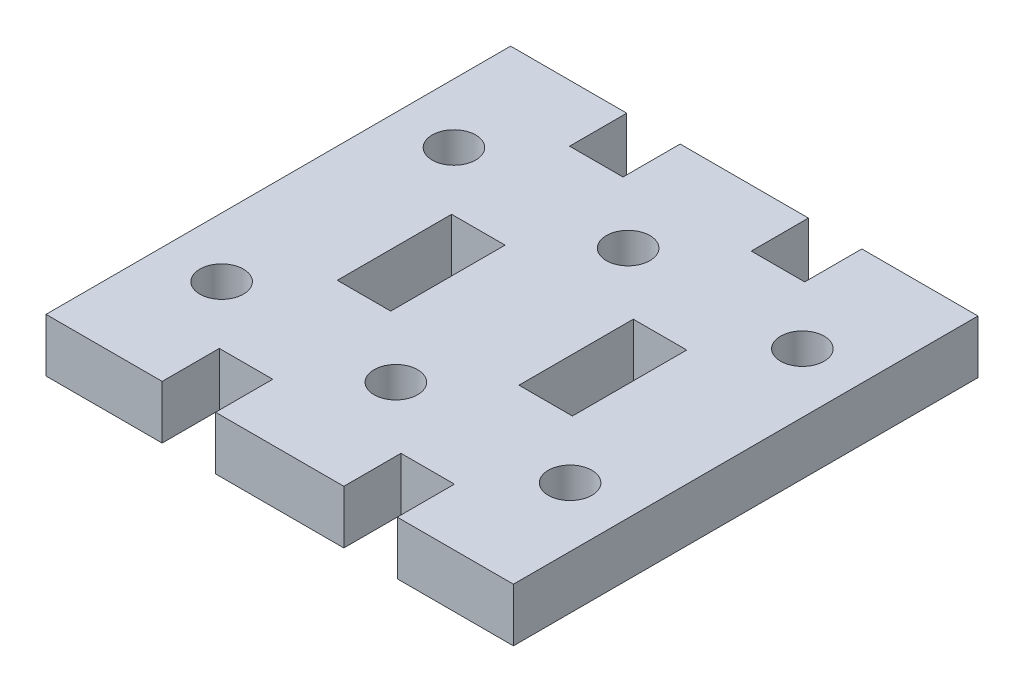
ISO-10303-21;
HEADER;
FILE_DESCRIPTION(('STEP AP214'),'2;1');
FILE_NAME('part.step','',(''),(''),'','','');
FILE_SCHEMA(('AUTOMOTIVE_DESIGN { 1 0 10303 214 1 1 1 1 }'));
ENDSEC;
DATA;
#1=APPLICATION_CONTEXT('core data for automotive mechanical design processes');
#2=APPLICATION_PROTOCOL_DEFINITION('international standard','automotive_design',2000,#1);
#3=PRODUCT_CONTEXT('',#1,'mechanical');
#4=PRODUCT('Part','Part','',(#3));
#5=PRODUCT_RELATED_PRODUCT_CATEGORY('part','',(#4));
#6=PRODUCT_DEFINITION_FORMATION('','',#4);
#7=PRODUCT_DEFINITION_CONTEXT('part definition',#1,'design');
#8=PRODUCT_DEFINITION('design','',#6,#7);
#9=PRODUCT_DEFINITION_SHAPE('','',#8);
#10=(LENGTH_UNIT() NAMED_UNIT(*) SI_UNIT(.MILLI.,.METRE.));
#11=(NAMED_UNIT(*) PLANE_ANGLE_UNIT() SI_UNIT($,.RADIAN.));
#12=(NAMED_UNIT(*) SI_UNIT($,.STERADIAN.) SOLID_ANGLE_UNIT());
#13=UNCERTAINTY_MEASURE_WITH_UNIT(LENGTH_MEASURE(1.E-05),#10,'distance_accuracy_value','');
#14=(GEOMETRIC_REPRESENTATION_CONTEXT(3) GLOBAL_UNCERTAINTY_ASSIGNED_CONTEXT((#13)) GLOBAL_UNIT_ASSIGNED_CONTEXT((#10,
#11,#12)) REPRESENTATION_CONTEXT('',''));
#15=CARTESIAN_POINT('',(0.,0.,0.));
#16=DIRECTION('',(0.,0.,1.));
#17=DIRECTION('',(1.,0.,0.));
#18=AXIS2_PLACEMENT_3D('',#15,#16,#17);
#19=CARTESIAN_POINT('',(0.,5.842,0.));
#20=DIRECTION('',(0.,1.,0.));
#21=DIRECTION('',(0.,0.,1.));
#22=AXIS2_PLACEMENT_3D('',#19,#20,#21);
#23=PLANE('',#22);
#24=CARTESIAN_POINT('',(-19.05,5.842,12.7));
#25=DIRECTION('',(0.,1.,0.));
#26=DIRECTION('',(0.,0.,1.));
#27=AXIS2_PLACEMENT_3D('',#24,#25,#26);
#28=CIRCLE('',#27,2.38125);
#29=CARTESIAN_POINT('',(-19.05,5.842,15.08125));
#30=VERTEX_POINT('',#29);
#31=EDGE_CURVE('E848',#30,#30,#28,.T.);
#32=ORIENTED_EDGE('',*,*,#31,.F.);
#33=EDGE_LOOP('',(#32));
#34=FACE_BOUND('',#33,.T.);
#35=CARTESIAN_POINT('',(-19.05,5.842,-12.7));
#36=DIRECTION('',(0.,1.,0.));
#37=DIRECTION('',(0.,0.,-1.));
#38=AXIS2_PLACEMENT_3D('',#35,#36,#37);
#39=CIRCLE('',#38,2.38125);
#40=CARTESIAN_POINT('',(-19.05,5.842,-15.08125));
#41=VERTEX_POINT('',#40);
#42=EDGE_CURVE('E850',#41,#41,#39,.T.);
#43=ORIENTED_EDGE('',*,*,#42,.F.);
#44=EDGE_LOOP('',(#43));
#45=FACE_BOUND('',#44,.T.);
#46=CARTESIAN_POINT('',(19.05,5.842,12.7));
#47=DIRECTION('',(0.,1.,0.));
#48=DIRECTION('',(0.,0.,-1.));
#49=AXIS2_PLACEMENT_3D('',#46,#47,#48);
#50=CIRCLE('',#49,2.38125);
#51=CARTESIAN_POINT('',(19.05,5.842,10.31875));
#52=VERTEX_POINT('',#51);
#53=EDGE_CURVE('E856',#52,#52,#50,.T.);
#54=ORIENTED_EDGE('',*,*,#53,.F.);
#55=EDGE_LOOP('',(#54));
#56=FACE_BOUND('',#55,.T.);
#57=CARTESIAN_POINT('',(19.05,5.842,-12.7));
#58=DIRECTION('',(0.,1.,0.));
#59=DIRECTION('',(0.,0.,1.));
#60=AXIS2_PLACEMENT_3D('',#57,#58,#59);
#61=CIRCLE('',#60,2.38125);
#62=CARTESIAN_POINT('',(19.05,5.842,-10.31875));
#63=VERTEX_POINT('',#62);
#64=EDGE_CURVE('E862',#63,#63,#61,.T.);
#65=ORIENTED_EDGE('',*,*,#64,.F.);
#66=EDGE_LOOP('',(#65));
#67=FACE_BOUND('',#66,.T.);
#68=CARTESIAN_POINT('',(0.,5.842,-12.7));
#69=DIRECTION('',(0.,1.,0.));
#70=DIRECTION('',(0.,0.,-1.));
#71=AXIS2_PLACEMENT_3D('',#68,#69,#70);
#72=CIRCLE('',#71,2.38125);
#73=CARTESIAN_POINT('',(0.,5.842,-15.08125));
#74=VERTEX_POINT('',#73);
#75=EDGE_CURVE('E868',#74,#74,#72,.T.);
#76=ORIENTED_EDGE('',*,*,#75,.F.);
#77=EDGE_LOOP('',(#76));
#78=FACE_BOUND('',#77,.T.);
#79=CARTESIAN_POINT('',(0.,5.842,12.7));
#80=DIRECTION('',(0.,1.,0.));
#81=DIRECTION('',(0.,0.,1.));
#82=AXIS2_PLACEMENT_3D('',#79,#80,#81);
#83=CIRCLE('',#82,2.38125);
#84=CARTESIAN_POINT('',(0.,5.842,15.08125));
#85=VERTEX_POINT('',#84);
#86=EDGE_CURVE('E874',#85,#85,#83,.T.);
#87=ORIENTED_EDGE('',*,*,#86,.F.);
#88=EDGE_LOOP('',(#87));
#89=FACE_BOUND('',#88,.T.);
#90=DIRECTION('',(0.,0.,1.));
#91=VECTOR('',#90,1.);
#92=CARTESIAN_POINT('',(-7.012,5.842,-19.15));
#93=LINE('',#92,#91);
#94=CARTESIAN_POINT('',(-7.012,5.842,-25.4));
#95=VERTEX_POINT('',#94);
#96=CARTESIAN_POINT('',(-7.012,5.842,-19.15));
#97=VERTEX_POINT('',#96);
#98=EDGE_CURVE('E289',#95,#97,#93,.T.);
#99=ORIENTED_EDGE('',*,*,#98,.T.);
#100=DIRECTION('',(-1.,0.,0.));
#101=VECTOR('',#100,1.);
#102=CARTESIAN_POINT('',(-12.854,5.842,-19.15));
#103=LINE('',#102,#101);
#104=CARTESIAN_POINT('',(-12.854,5.842,-19.15));
#105=VERTEX_POINT('',#104);
#106=EDGE_CURVE('E292',#97,#105,#103,.T.);
#107=ORIENTED_EDGE('',*,*,#106,.T.);
#108=DIRECTION('',(0.,0.,-1.));
#109=VECTOR('',#108,1.);
#110=CARTESIAN_POINT('',(-12.854,5.842,-19.15));
#111=LINE('',#110,#109);
#112=CARTESIAN_POINT('',(-12.854,5.842,-25.4));
#113=VERTEX_POINT('',#112);
#114=EDGE_CURVE('E295',#105,#113,#111,.T.);
#115=ORIENTED_EDGE('',*,*,#114,.T.);
#116=DIRECTION('',(-1.,0.,0.));
#117=VECTOR('',#116,1.);
#118=CARTESIAN_POINT('',(-25.554,5.842,-25.4));
#119=LINE('',#118,#117);
#120=CARTESIAN_POINT('',(-25.554,5.842,-25.4));
#121=VERTEX_POINT('',#120);
#122=EDGE_CURVE('E297',#113,#121,#119,.T.);
#123=ORIENTED_EDGE('',*,*,#122,.T.);
#124=DIRECTION('',(0.,0.,1.));
#125=VECTOR('',#124,1.);
#126=CARTESIAN_POINT('',(-25.554,5.842,25.4));
#127=LINE('',#126,#125);
#128=CARTESIAN_POINT('',(-25.554,5.842,25.4));
#129=VERTEX_POINT('',#128);
#130=EDGE_CURVE('E299',#121,#129,#127,.T.);
#131=ORIENTED_EDGE('',*,*,#130,.T.);
#132=DIRECTION('',(1.,0.,0.));
#133=VECTOR('',#132,1.);
#134=CARTESIAN_POINT('',(-25.554,5.842,25.4));
#135=LINE('',#134,#133);
#136=CARTESIAN_POINT('',(-12.854,5.842,25.4));
#137=VERTEX_POINT('',#136);
#138=EDGE_CURVE('E301',#129,#137,#135,.T.);
#139=ORIENTED_EDGE('',*,*,#138,.T.);
#140=DIRECTION('',(0.,0.,-1.));
#141=VECTOR('',#140,1.);
#142=CARTESIAN_POINT('',(-12.854,5.842,25.4));
#143=LINE('',#142,#141);
#144=CARTESIAN_POINT('',(-12.854,5.842,19.15));
#145=VERTEX_POINT('',#144);
#146=EDGE_CURVE('E303',#137,#145,#143,.T.);
#147=ORIENTED_EDGE('',*,*,#146,.T.);
#148=DIRECTION('',(1.,0.,0.));
#149=VECTOR('',#148,1.);
#150=CARTESIAN_POINT('',(-12.854,5.842,19.15));
#151=LINE('',#150,#149);
#152=CARTESIAN_POINT('',(-7.012,5.842,19.15));
#153=VERTEX_POINT('',#152);
#154=EDGE_CURVE('E305',#145,#153,#151,.T.);
#155=ORIENTED_EDGE('',*,*,#154,.T.);
#156=DIRECTION('',(0.,0.,1.));
#157=VECTOR('',#156,1.);
#158=CARTESIAN_POINT('',(-7.012,5.842,25.4));
#159=LINE('',#158,#157);
#160=CARTESIAN_POINT('',(-7.012,5.842,25.4));
#161=VERTEX_POINT('',#160);
#162=EDGE_CURVE('E307',#153,#161,#159,.T.);
#163=ORIENTED_EDGE('',*,*,#162,.T.);
#164=DIRECTION('',(1.,0.,0.));
#165=VECTOR('',#164,1.);
#166=CARTESIAN_POINT('',(7.012,5.842,25.4));
#167=LINE('',#166,#165);
#168=CARTESIAN_POINT('',(7.012,5.842,25.4));
#169=VERTEX_POINT('',#168);
#170=EDGE_CURVE('E309',#161,#169,#167,.T.);
#171=ORIENTED_EDGE('',*,*,#170,.T.);
#172=DIRECTION('',(0.,0.,-1.));
#173=VECTOR('',#172,1.);
#174=CARTESIAN_POINT('',(7.012,5.842,25.4));
#175=LINE('',#174,#173);
#176=CARTESIAN_POINT('',(7.012,5.842,19.15));
#177=VERTEX_POINT('',#176);
#178=EDGE_CURVE('E311',#169,#177,#175,.T.);
#179=ORIENTED_EDGE('',*,*,#178,.T.);
#180=DIRECTION('',(1.,0.,0.));
#181=VECTOR('',#180,1.);
#182=CARTESIAN_POINT('',(12.854,5.842,19.15));
#183=LINE('',#182,#181);
#184=CARTESIAN_POINT('',(12.854,5.842,19.15));
#185=VERTEX_POINT('',#184);
#186=EDGE_CURVE('E313',#177,#185,#183,.T.);
#187=ORIENTED_EDGE('',*,*,#186,.T.);
#188=DIRECTION('',(0.,0.,1.));
#189=VECTOR('',#188,1.);
#190=CARTESIAN_POINT('',(12.854,5.842,25.4));
#191=LINE('',#190,#189);
#192=CARTESIAN_POINT('',(12.854,5.842,25.4));
#193=VERTEX_POINT('',#192);
#194=EDGE_CURVE('E315',#185,#193,#191,.T.);
#195=ORIENTED_EDGE('',*,*,#194,.T.);
#196=DIRECTION('',(1.,0.,0.));
#197=VECTOR('',#196,1.);
#198=CARTESIAN_POINT('',(25.554,5.842,25.4));
#199=LINE('',#198,#197);
#200=CARTESIAN_POINT('',(25.554,5.842,25.4));
#201=VERTEX_POINT('',#200);
#202=EDGE_CURVE('E317',#193,#201,#199,.T.);
#203=ORIENTED_EDGE('',*,*,#202,.T.);
#204=DIRECTION('',(0.,0.,-1.));
#205=VECTOR('',#204,1.);
#206=CARTESIAN_POINT('',(25.554,5.842,25.4));
#207=LINE('',#206,#205);
#208=CARTESIAN_POINT('',(25.554,5.842,-25.4));
#209=VERTEX_POINT('',#208);
#210=EDGE_CURVE('E319',#201,#209,#207,.T.);
#211=ORIENTED_EDGE('',*,*,#210,.T.);
#212=DIRECTION('',(-1.,0.,0.));
#213=VECTOR('',#212,1.);
#214=CARTESIAN_POINT('',(25.554,5.842,-25.4));
#215=LINE('',#214,#213);
#216=CARTESIAN_POINT('',(12.854,5.842,-25.4));
#217=VERTEX_POINT('',#216);
#218=EDGE_CURVE('E321',#209,#217,#215,.T.);
#219=ORIENTED_EDGE('',*,*,#218,.T.);
#220=DIRECTION('',(0.,0.,1.));
#221=VECTOR('',#220,1.);
#222=CARTESIAN_POINT('',(12.854,5.842,-19.15));
#223=LINE('',#222,#221);
#224=CARTESIAN_POINT('',(12.854,5.842,-19.15));
#225=VERTEX_POINT('',#224);
#226=EDGE_CURVE('E323',#217,#225,#223,.T.);
#227=ORIENTED_EDGE('',*,*,#226,.T.);
#228=DIRECTION('',(-1.,0.,0.));
#229=VECTOR('',#228,1.);
#230=CARTESIAN_POINT('',(12.854,5.842,-19.15));
#231=LINE('',#230,#229);
#232=CARTESIAN_POINT('',(7.012,5.842,-19.15));
#233=VERTEX_POINT('',#232);
#234=EDGE_CURVE('E325',#225,#233,#231,.T.);
#235=ORIENTED_EDGE('',*,*,#234,.T.);
#236=DIRECTION('',(0.,0.,-1.));
#237=VECTOR('',#236,1.);
#238=CARTESIAN_POINT('',(7.012,5.842,-19.15));
#239=LINE('',#238,#237);
#240=CARTESIAN_POINT('',(7.012,5.842,-25.4));
#241=VERTEX_POINT('',#240);
#242=EDGE_CURVE('E327',#233,#241,#239,.T.);
#243=ORIENTED_EDGE('',*,*,#242,.T.);
#244=DIRECTION('',(-1.,0.,0.));
#245=VECTOR('',#244,1.);
#246=CARTESIAN_POINT('',(7.012,5.842,-25.4));
#247=LINE('',#246,#245);
#248=EDGE_CURVE('E329',#241,#95,#247,.T.);
#249=ORIENTED_EDGE('',*,*,#248,.T.);
#250=EDGE_LOOP('',(#99,#107,#115,#123,#131,#139,#147,#155,#163,#171,#179,#187,#195,#203,#211,
#219,#227,#235,#243,#249));
#251=FACE_BOUND('',#250,.T.);
#252=DIRECTION('',(1.,0.,0.));
#253=VECTOR('',#252,1.);
#254=CARTESIAN_POINT('',(-12.854,5.842,6.24999999999999));
#255=LINE('',#254,#253);
#256=CARTESIAN_POINT('',(-12.854,5.842,6.24999999999999));
#257=VERTEX_POINT('',#256);
#258=CARTESIAN_POINT('',(-7.012,5.842,6.24999999999999));
#259=VERTEX_POINT('',#258);
#260=EDGE_CURVE('E260',#257,#259,#255,.T.);
#261=ORIENTED_EDGE('',*,*,#260,.F.);
#262=DIRECTION('',(0.,0.,1.));
#263=VECTOR('',#262,1.);
#264=CARTESIAN_POINT('',(-12.854,5.842,6.24999999999999));
#265=LINE('',#264,#263);
#266=CARTESIAN_POINT('',(-12.854,5.842,-6.25));
#267=VERTEX_POINT('',#266);
#268=EDGE_CURVE('E258',#267,#257,#265,.T.);
#269=ORIENTED_EDGE('',*,*,#268,.F.);
#270=DIRECTION('',(-1.,0.,0.));
#271=VECTOR('',#270,1.);
#272=CARTESIAN_POINT('',(-12.854,5.842,-6.25));
#273=LINE('',#272,#271);
#274=CARTESIAN_POINT('',(-7.012,5.842,-6.25));
#275=VERTEX_POINT('',#274);
#276=EDGE_CURVE('E266',#275,#267,#273,.T.);
#277=ORIENTED_EDGE('',*,*,#276,.F.);
#278=DIRECTION('',(0.,0.,-1.));
#279=VECTOR('',#278,1.);
#280=CARTESIAN_POINT('',(-7.012,5.842,6.24999999999999));
#281=LINE('',#280,#279);
#282=EDGE_CURVE('E263',#259,#275,#281,.T.);
#283=ORIENTED_EDGE('',*,*,#282,.F.);
#284=EDGE_LOOP('',(#261,#269,#277,#283));
#285=FACE_BOUND('',#284,.T.);
#286=DIRECTION('',(0.,0.,-1.));
#287=VECTOR('',#286,1.);
#288=CARTESIAN_POINT('',(12.854,5.842,6.24999999999999));
#289=LINE('',#288,#287);
#290=CARTESIAN_POINT('',(12.854,5.842,6.24999999999999));
#291=VERTEX_POINT('',#290);
#292=CARTESIAN_POINT('',(12.854,5.842,-6.25));
#293=VERTEX_POINT('',#292);
#294=EDGE_CURVE('E228',#291,#293,#289,.T.);
#295=ORIENTED_EDGE('',*,*,#294,.F.);
#296=DIRECTION('',(1.,0.,0.));
#297=VECTOR('',#296,1.);
#298=CARTESIAN_POINT('',(12.854,5.842,6.24999999999999));
#299=LINE('',#298,#297);
#300=CARTESIAN_POINT('',(7.012,5.842,6.24999999999999));
#301=VERTEX_POINT('',#300);
#302=EDGE_CURVE('E220',#301,#291,#299,.T.);
#303=ORIENTED_EDGE('',*,*,#302,.F.);
#304=DIRECTION('',(0.,0.,1.));
#305=VECTOR('',#304,1.);
#306=CARTESIAN_POINT('',(7.012,5.842,6.24999999999999));
#307=LINE('',#306,#305);
#308=CARTESIAN_POINT('',(7.012,5.842,-6.25));
#309=VERTEX_POINT('',#308);
#310=EDGE_CURVE('E242',#309,#301,#307,.T.);
#311=ORIENTED_EDGE('',*,*,#310,.F.);
#312=DIRECTION('',(-1.,0.,0.));
#313=VECTOR('',#312,1.);
#314=CARTESIAN_POINT('',(12.854,5.842,-6.25));
#315=LINE('',#314,#313);
#316=EDGE_CURVE('E240',#293,#309,#315,.T.);
#317=ORIENTED_EDGE('',*,*,#316,.F.);
#318=EDGE_LOOP('',(#295,#303,#311,#317));
#319=FACE_BOUND('',#318,.T.);
#320=ADVANCED_FACE('F35',(#34,#45,#56,#67,#78,#89,#251,#285,#319),#23,.T.);
#321=CARTESIAN_POINT('',(0.,0.,0.));
#322=DIRECTION('',(0.,1.,0.));
#323=DIRECTION('',(0.,0.,1.));
#324=AXIS2_PLACEMENT_3D('',#321,#322,#323);
#325=PLANE('',#324);
#326=CARTESIAN_POINT('',(-19.05,0.,12.7));
#327=DIRECTION('',(0.,1.,0.));
#328=DIRECTION('',(0.,0.,1.));
#329=AXIS2_PLACEMENT_3D('',#326,#327,#328);
#330=CIRCLE('',#329,2.38125);
#331=CARTESIAN_POINT('',(-19.05,0.,15.08125));
#332=VERTEX_POINT('',#331);
#333=EDGE_CURVE('E846',#332,#332,#330,.T.);
#334=ORIENTED_EDGE('',*,*,#333,.T.);
#335=EDGE_LOOP('',(#334));
#336=FACE_BOUND('',#335,.T.);
#337=CARTESIAN_POINT('',(-19.05,0.,-12.7));
#338=DIRECTION('',(0.,1.,0.));
#339=DIRECTION('',(0.,0.,-1.));
#340=AXIS2_PLACEMENT_3D('',#337,#338,#339);
#341=CIRCLE('',#340,2.38125);
#342=CARTESIAN_POINT('',(-19.05,0.,-15.08125));
#343=VERTEX_POINT('',#342);
#344=EDGE_CURVE('E853',#343,#343,#341,.T.);
#345=ORIENTED_EDGE('',*,*,#344,.T.);
#346=EDGE_LOOP('',(#345));
#347=FACE_BOUND('',#346,.T.);
#348=CARTESIAN_POINT('',(19.05,0.,12.7));
#349=DIRECTION('',(0.,1.,0.));
#350=DIRECTION('',(0.,0.,-1.));
#351=AXIS2_PLACEMENT_3D('',#348,#349,#350);
#352=CIRCLE('',#351,2.38125);
#353=CARTESIAN_POINT('',(19.05,0.,10.31875));
#354=VERTEX_POINT('',#353);
#355=EDGE_CURVE('E859',#354,#354,#352,.T.);
#356=ORIENTED_EDGE('',*,*,#355,.T.);
#357=EDGE_LOOP('',(#356));
#358=FACE_BOUND('',#357,.T.);
#359=CARTESIAN_POINT('',(19.05,0.,-12.7));
#360=DIRECTION('',(0.,1.,0.));
#361=DIRECTION('',(0.,0.,1.));
#362=AXIS2_PLACEMENT_3D('',#359,#360,#361);
#363=CIRCLE('',#362,2.38125);
#364=CARTESIAN_POINT('',(19.05,0.,-10.31875));
#365=VERTEX_POINT('',#364);
#366=EDGE_CURVE('E865',#365,#365,#363,.T.);
#367=ORIENTED_EDGE('',*,*,#366,.T.);
#368=EDGE_LOOP('',(#367));
#369=FACE_BOUND('',#368,.T.);
#370=CARTESIAN_POINT('',(0.,0.,-12.7));
#371=DIRECTION('',(0.,1.,0.));
#372=DIRECTION('',(0.,0.,-1.));
#373=AXIS2_PLACEMENT_3D('',#370,#371,#372);
#374=CIRCLE('',#373,2.38125);
#375=CARTESIAN_POINT('',(0.,0.,-15.08125));
#376=VERTEX_POINT('',#375);
#377=EDGE_CURVE('E871',#376,#376,#374,.T.);
#378=ORIENTED_EDGE('',*,*,#377,.T.);
#379=EDGE_LOOP('',(#378));
#380=FACE_BOUND('',#379,.T.);
#381=CARTESIAN_POINT('',(0.,0.,12.7));
#382=DIRECTION('',(0.,1.,0.));
#383=DIRECTION('',(0.,0.,1.));
#384=AXIS2_PLACEMENT_3D('',#381,#382,#383);
#385=CIRCLE('',#384,2.38125);
#386=CARTESIAN_POINT('',(0.,0.,15.08125));
#387=VERTEX_POINT('',#386);
#388=EDGE_CURVE('E248',#387,#387,#385,.T.);
#389=ORIENTED_EDGE('',*,*,#388,.T.);
#390=EDGE_LOOP('',(#389));
#391=FACE_BOUND('',#390,.T.);
#392=DIRECTION('',(0.,0.,1.));
#393=VECTOR('',#392,1.);
#394=CARTESIAN_POINT('',(-12.854,0.,6.24999999999999));
#395=LINE('',#394,#393);
#396=CARTESIAN_POINT('',(-12.854,0.,-6.25));
#397=VERTEX_POINT('',#396);
#398=CARTESIAN_POINT('',(-12.854,0.,6.24999999999999));
#399=VERTEX_POINT('',#398);
#400=EDGE_CURVE('E236',#397,#399,#395,.T.);
#401=ORIENTED_EDGE('',*,*,#400,.T.);
#402=DIRECTION('',(1.,0.,0.));
#403=VECTOR('',#402,1.);
#404=CARTESIAN_POINT('',(-12.854,0.,6.24999999999999));
#405=LINE('',#404,#403);
#406=CARTESIAN_POINT('',(-7.012,0.,6.24999999999999));
#407=VERTEX_POINT('',#406);
#408=EDGE_CURVE('E271',#399,#407,#405,.T.);
#409=ORIENTED_EDGE('',*,*,#408,.T.);
#410=DIRECTION('',(0.,0.,-1.));
#411=VECTOR('',#410,1.);
#412=CARTESIAN_POINT('',(-7.012,0.,6.24999999999999));
#413=LINE('',#412,#411);
#414=CARTESIAN_POINT('',(-7.012,0.,-6.25));
#415=VERTEX_POINT('',#414);
#416=EDGE_CURVE('E274',#407,#415,#413,.T.);
#417=ORIENTED_EDGE('',*,*,#416,.T.);
#418=DIRECTION('',(-1.,0.,0.));
#419=VECTOR('',#418,1.);
#420=CARTESIAN_POINT('',(-12.854,0.,-6.25));
#421=LINE('',#420,#419);
#422=EDGE_CURVE('E261',#415,#397,#421,.T.);
#423=ORIENTED_EDGE('',*,*,#422,.T.);
#424=EDGE_LOOP('',(#401,#409,#417,#423));
#425=FACE_BOUND('',#424,.T.);
#426=DIRECTION('',(0.,0.,1.));
#427=VECTOR('',#426,1.);
#428=CARTESIAN_POINT('',(-7.012,0.,-19.15));
#429=LINE('',#428,#427);
#430=CARTESIAN_POINT('',(-7.012,0.,-25.4));
#431=VERTEX_POINT('',#430);
#432=CARTESIAN_POINT('',(-7.012,0.,-19.15));
#433=VERTEX_POINT('',#432);
#434=EDGE_CURVE('E288',#431,#433,#429,.T.);
#435=ORIENTED_EDGE('',*,*,#434,.F.);
#436=DIRECTION('',(-1.,0.,0.));
#437=VECTOR('',#436,1.);
#438=CARTESIAN_POINT('',(7.012,0.,-25.4));
#439=LINE('',#438,#437);
#440=CARTESIAN_POINT('',(7.012,0.,-25.4));
#441=VERTEX_POINT('',#440);
#442=EDGE_CURVE('E293',#441,#431,#439,.T.);
#443=ORIENTED_EDGE('',*,*,#442,.F.);
#444=DIRECTION('',(0.,0.,-1.));
#445=VECTOR('',#444,1.);
#446=CARTESIAN_POINT('',(7.012,0.,-19.15));
#447=LINE('',#446,#445);
#448=CARTESIAN_POINT('',(7.012,0.,-19.15));
#449=VERTEX_POINT('',#448);
#450=EDGE_CURVE('E368',#449,#441,#447,.T.);
#451=ORIENTED_EDGE('',*,*,#450,.F.);
#452=DIRECTION('',(-1.,0.,0.));
#453=VECTOR('',#452,1.);
#454=CARTESIAN_POINT('',(12.854,0.,-19.15));
#455=LINE('',#454,#453);
#456=CARTESIAN_POINT('',(12.854,0.,-19.15));
#457=VERTEX_POINT('',#456);
#458=EDGE_CURVE('E366',#457,#449,#455,.T.);
#459=ORIENTED_EDGE('',*,*,#458,.F.);
#460=DIRECTION('',(0.,0.,1.));
#461=VECTOR('',#460,1.);
#462=CARTESIAN_POINT('',(12.854,0.,-19.15));
#463=LINE('',#462,#461);
#464=CARTESIAN_POINT('',(12.854,0.,-25.4));
#465=VERTEX_POINT('',#464);
#466=EDGE_CURVE('E364',#465,#457,#463,.T.);
#467=ORIENTED_EDGE('',*,*,#466,.F.);
#468=DIRECTION('',(-1.,0.,0.));
#469=VECTOR('',#468,1.);
#470=CARTESIAN_POINT('',(25.554,0.,-25.4));
#471=LINE('',#470,#469);
#472=CARTESIAN_POINT('',(25.554,0.,-25.4));
#473=VERTEX_POINT('',#472);
#474=EDGE_CURVE('E362',#473,#465,#471,.T.);
#475=ORIENTED_EDGE('',*,*,#474,.F.);
#476=DIRECTION('',(0.,0.,-1.));
#477=VECTOR('',#476,1.);
#478=CARTESIAN_POINT('',(25.554,0.,25.4));
#479=LINE('',#478,#477);
#480=CARTESIAN_POINT('',(25.554,0.,25.4));
#481=VERTEX_POINT('',#480);
#482=EDGE_CURVE('E360',#481,#473,#479,.T.);
#483=ORIENTED_EDGE('',*,*,#482,.F.);
#484=DIRECTION('',(1.,0.,0.));
#485=VECTOR('',#484,1.);
#486=CARTESIAN_POINT('',(25.554,0.,25.4));
#487=LINE('',#486,#485);
#488=CARTESIAN_POINT('',(12.854,0.,25.4));
#489=VERTEX_POINT('',#488);
#490=EDGE_CURVE('E358',#489,#481,#487,.T.);
#491=ORIENTED_EDGE('',*,*,#490,.F.);
#492=DIRECTION('',(0.,0.,1.));
#493=VECTOR('',#492,1.);
#494=CARTESIAN_POINT('',(12.854,0.,25.4));
#495=LINE('',#494,#493);
#496=CARTESIAN_POINT('',(12.854,0.,19.15));
#497=VERTEX_POINT('',#496);
#498=EDGE_CURVE('E356',#497,#489,#495,.T.);
#499=ORIENTED_EDGE('',*,*,#498,.F.);
#500=DIRECTION('',(1.,0.,0.));
#501=VECTOR('',#500,1.);
#502=CARTESIAN_POINT('',(12.854,0.,19.15));
#503=LINE('',#502,#501);
#504=CARTESIAN_POINT('',(7.012,0.,19.15));
#505=VERTEX_POINT('',#504);
#506=EDGE_CURVE('E354',#505,#497,#503,.T.);
#507=ORIENTED_EDGE('',*,*,#506,.F.);
#508=DIRECTION('',(0.,0.,-1.));
#509=VECTOR('',#508,1.);
#510=CARTESIAN_POINT('',(7.012,0.,25.4));
#511=LINE('',#510,#509);
#512=CARTESIAN_POINT('',(7.012,0.,25.4));
#513=VERTEX_POINT('',#512);
#514=EDGE_CURVE('E352',#513,#505,#511,.T.);
#515=ORIENTED_EDGE('',*,*,#514,.F.);
#516=DIRECTION('',(1.,0.,0.));
#517=VECTOR('',#516,1.);
#518=CARTESIAN_POINT('',(7.012,0.,25.4));
#519=LINE('',#518,#517);
#520=CARTESIAN_POINT('',(-7.012,0.,25.4));
#521=VERTEX_POINT('',#520);
#522=EDGE_CURVE('E350',#521,#513,#519,.T.);
#523=ORIENTED_EDGE('',*,*,#522,.F.);
#524=DIRECTION('',(0.,0.,1.));
#525=VECTOR('',#524,1.);
#526=CARTESIAN_POINT('',(-7.012,0.,25.4));
#527=LINE('',#526,#525);
#528=CARTESIAN_POINT('',(-7.012,0.,19.15));
#529=VERTEX_POINT('',#528);
#530=EDGE_CURVE('E348',#529,#521,#527,.T.);
#531=ORIENTED_EDGE('',*,*,#530,.F.);
#532=DIRECTION('',(1.,0.,0.));
#533=VECTOR('',#532,1.);
#534=CARTESIAN_POINT('',(-12.854,0.,19.15));
#535=LINE('',#534,#533);
#536=CARTESIAN_POINT('',(-12.854,0.,19.15));
#537=VERTEX_POINT('',#536);
#538=EDGE_CURVE('E346',#537,#529,#535,.T.);
#539=ORIENTED_EDGE('',*,*,#538,.F.);
#540=DIRECTION('',(0.,0.,-1.));
#541=VECTOR('',#540,1.);
#542=CARTESIAN_POINT('',(-12.854,0.,25.4));
#543=LINE('',#542,#541);
#544=CARTESIAN_POINT('',(-12.854,0.,25.4));
#545=VERTEX_POINT('',#544);
#546=EDGE_CURVE('E344',#545,#537,#543,.T.);
#547=ORIENTED_EDGE('',*,*,#546,.F.);
#548=DIRECTION('',(1.,0.,0.));
#549=VECTOR('',#548,1.);
#550=CARTESIAN_POINT('',(-25.554,0.,25.4));
#551=LINE('',#550,#549);
#552=CARTESIAN_POINT('',(-25.554,0.,25.4));
#553=VERTEX_POINT('',#552);
#554=EDGE_CURVE('E342',#553,#545,#551,.T.);
#555=ORIENTED_EDGE('',*,*,#554,.F.);
#556=DIRECTION('',(0.,0.,1.));
#557=VECTOR('',#556,1.);
#558=CARTESIAN_POINT('',(-25.554,0.,25.4));
#559=LINE('',#558,#557);
#560=CARTESIAN_POINT('',(-25.554,0.,-25.4));
#561=VERTEX_POINT('',#560);
#562=EDGE_CURVE('E340',#561,#553,#559,.T.);
#563=ORIENTED_EDGE('',*,*,#562,.F.);
#564=DIRECTION('',(-1.,0.,0.));
#565=VECTOR('',#564,1.);
#566=CARTESIAN_POINT('',(-25.554,0.,-25.4));
#567=LINE('',#566,#565);
#568=CARTESIAN_POINT('',(-12.854,0.,-25.4));
#569=VERTEX_POINT('',#568);
#570=EDGE_CURVE('E338',#569,#561,#567,.T.);
#571=ORIENTED_EDGE('',*,*,#570,.F.);
#572=DIRECTION('',(0.,0.,-1.));
#573=VECTOR('',#572,1.);
#574=CARTESIAN_POINT('',(-12.854,0.,-19.15));
#575=LINE('',#574,#573);
#576=CARTESIAN_POINT('',(-12.854,0.,-19.15));
#577=VERTEX_POINT('',#576);
#578=EDGE_CURVE('E336',#577,#569,#575,.T.);
#579=ORIENTED_EDGE('',*,*,#578,.F.);
#580=DIRECTION('',(-1.,0.,0.));
#581=VECTOR('',#580,1.);
#582=CARTESIAN_POINT('',(-12.854,0.,-19.15));
#583=LINE('',#582,#581);
#584=EDGE_CURVE('E334',#433,#577,#583,.T.);
#585=ORIENTED_EDGE('',*,*,#584,.F.);
#586=EDGE_LOOP('',(#435,#443,#451,#459,#467,#475,#483,#491,#499,#507,#515,#523,#531,#539,#547,
#555,#563,#571,#579,#585));
#587=FACE_BOUND('',#586,.T.);
#588=DIRECTION('',(1.,0.,0.));
#589=VECTOR('',#588,1.);
#590=CARTESIAN_POINT('',(12.854,0.,6.24999999999999));
#591=LINE('',#590,#589);
#592=CARTESIAN_POINT('',(7.012,0.,6.24999999999999));
#593=VERTEX_POINT('',#592);
#594=CARTESIAN_POINT('',(12.854,0.,6.24999999999999));
#595=VERTEX_POINT('',#594);
#596=EDGE_CURVE('E58',#593,#595,#591,.T.);
#597=ORIENTED_EDGE('',*,*,#596,.T.);
#598=DIRECTION('',(0.,0.,-1.));
#599=VECTOR('',#598,1.);
#600=CARTESIAN_POINT('',(12.854,0.,6.24999999999999));
#601=LINE('',#600,#599);
#602=CARTESIAN_POINT('',(12.854,0.,-6.25));
#603=VERTEX_POINT('',#602);
#604=EDGE_CURVE('E235',#595,#603,#601,.T.);
#605=ORIENTED_EDGE('',*,*,#604,.T.);
#606=DIRECTION('',(-1.,0.,0.));
#607=VECTOR('',#606,1.);
#608=CARTESIAN_POINT('',(12.854,0.,-6.25));
#609=LINE('',#608,#607);
#610=CARTESIAN_POINT('',(7.012,0.,-6.25));
#611=VERTEX_POINT('',#610);
#612=EDGE_CURVE('E250',#603,#611,#609,.T.);
#613=ORIENTED_EDGE('',*,*,#612,.T.);
#614=DIRECTION('',(0.,0.,1.));
#615=VECTOR('',#614,1.);
#616=CARTESIAN_POINT('',(7.012,0.,6.24999999999999));
#617=LINE('',#616,#615);
#618=EDGE_CURVE('E229',#611,#593,#617,.T.);
#619=ORIENTED_EDGE('',*,*,#618,.T.);
#620=EDGE_LOOP('',(#597,#605,#613,#619));
#621=FACE_BOUND('',#620,.T.);
#622=ADVANCED_FACE('F434',(#336,#347,#358,#369,#380,#391,#425,#587,#621),#325,.F.);
#623=CARTESIAN_POINT('',(-7.012,5.842,-19.15));
#624=DIRECTION('',(1.,0.,0.));
#625=DIRECTION('',(0.,0.,-1.));
#626=AXIS2_PLACEMENT_3D('',#623,#624,#625);
#627=PLANE('',#626);
#628=ORIENTED_EDGE('',*,*,#434,.T.);
#629=DIRECTION('',(0.,-1.,0.));
#630=VECTOR('',#629,1.);
#631=CARTESIAN_POINT('',(-7.012,5.842,-19.15));
#632=LINE('',#631,#630);
#633=EDGE_CURVE('E11',#97,#433,#632,.T.);
#634=ORIENTED_EDGE('',*,*,#633,.F.);
#635=ORIENTED_EDGE('',*,*,#98,.F.);
#636=DIRECTION('',(0.,-1.,0.));
#637=VECTOR('',#636,1.);
#638=CARTESIAN_POINT('',(-7.012,5.842,-25.4));
#639=LINE('',#638,#637);
#640=EDGE_CURVE('E331',#95,#431,#639,.T.);
#641=ORIENTED_EDGE('',*,*,#640,.T.);
#642=EDGE_LOOP('',(#628,#634,#635,#641));
#643=FACE_BOUND('',#642,.T.);
#644=ADVANCED_FACE('F37',(#643),#627,.F.);
#645=CARTESIAN_POINT('',(-12.854,5.842,-19.15));
#646=DIRECTION('',(0.,0.,1.));
#647=DIRECTION('',(1.,0.,0.));
#648=AXIS2_PLACEMENT_3D('',#645,#646,#647);
#649=PLANE('',#648);
#650=ORIENTED_EDGE('',*,*,#584,.T.);
#651=DIRECTION('',(0.,-1.,0.));
#652=VECTOR('',#651,1.);
#653=CARTESIAN_POINT('',(-12.854,5.842,-19.15));
#654=LINE('',#653,#652);
#655=EDGE_CURVE('E43',#105,#577,#654,.T.);
#656=ORIENTED_EDGE('',*,*,#655,.F.);
#657=ORIENTED_EDGE('',*,*,#106,.F.);
#658=ORIENTED_EDGE('',*,*,#633,.T.);
#659=EDGE_LOOP('',(#650,#656,#657,#658));
#660=FACE_BOUND('',#659,.T.);
#661=ADVANCED_FACE('F452',(#660),#649,.F.);
#662=CARTESIAN_POINT('',(-12.854,5.842,-19.15));
#663=DIRECTION('',(-1.,0.,0.));
#664=DIRECTION('',(0.,0.,1.));
#665=AXIS2_PLACEMENT_3D('',#662,#663,#664);
#666=PLANE('',#665);
#667=ORIENTED_EDGE('',*,*,#578,.T.);
#668=DIRECTION('',(0.,-1.,0.));
#669=VECTOR('',#668,1.);
#670=CARTESIAN_POINT('',(-12.854,5.842,-25.4));
#671=LINE('',#670,#669);
#672=EDGE_CURVE('E421',#113,#569,#671,.T.);
#673=ORIENTED_EDGE('',*,*,#672,.F.);
#674=ORIENTED_EDGE('',*,*,#114,.F.);
#675=ORIENTED_EDGE('',*,*,#655,.T.);
#676=EDGE_LOOP('',(#667,#673,#674,#675));
#677=FACE_BOUND('',#676,.T.);
#678=ADVANCED_FACE('F428',(#677),#666,.F.);
#679=CARTESIAN_POINT('',(-25.554,5.842,-25.4));
#680=DIRECTION('',(0.,0.,1.));
#681=DIRECTION('',(1.,0.,0.));
#682=AXIS2_PLACEMENT_3D('',#679,#680,#681);
#683=PLANE('',#682);
#684=ORIENTED_EDGE('',*,*,#570,.T.);
#685=DIRECTION('',(0.,-1.,0.));
#686=VECTOR('',#685,1.);
#687=CARTESIAN_POINT('',(-25.554,5.842,-25.4));
#688=LINE('',#687,#686);
#689=EDGE_CURVE('E418',#121,#561,#688,.T.);
#690=ORIENTED_EDGE('',*,*,#689,.F.);
#691=ORIENTED_EDGE('',*,*,#122,.F.);
#692=ORIENTED_EDGE('',*,*,#672,.T.);
#693=EDGE_LOOP('',(#684,#690,#691,#692));
#694=FACE_BOUND('',#693,.T.);
#695=ADVANCED_FACE('F440',(#694),#683,.F.);
#696=CARTESIAN_POINT('',(-25.554,5.842,25.4));
#697=DIRECTION('',(1.,0.,0.));
#698=DIRECTION('',(0.,0.,-1.));
#699=AXIS2_PLACEMENT_3D('',#696,#697,#698);
#700=PLANE('',#699);
#701=ORIENTED_EDGE('',*,*,#562,.T.);
#702=DIRECTION('',(0.,-1.,0.));
#703=VECTOR('',#702,1.);
#704=CARTESIAN_POINT('',(-25.554,5.842,25.4));
#705=LINE('',#704,#703);
#706=EDGE_CURVE('E415',#129,#553,#705,.T.);
#707=ORIENTED_EDGE('',*,*,#706,.F.);
#708=ORIENTED_EDGE('',*,*,#130,.F.);
#709=ORIENTED_EDGE('',*,*,#689,.T.);
#710=EDGE_LOOP('',(#701,#707,#708,#709));
#711=FACE_BOUND('',#710,.T.);
#712=ADVANCED_FACE('F444',(#711),#700,.F.);
#713=CARTESIAN_POINT('',(-25.554,5.842,25.4));
#714=DIRECTION('',(0.,0.,-1.));
#715=DIRECTION('',(-1.,0.,0.));
#716=AXIS2_PLACEMENT_3D('',#713,#714,#715);
#717=PLANE('',#716);
#718=ORIENTED_EDGE('',*,*,#554,.T.);
#719=DIRECTION('',(0.,-1.,0.));
#720=VECTOR('',#719,1.);
#721=CARTESIAN_POINT('',(-12.854,5.842,25.4));
#722=LINE('',#721,#720);
#723=EDGE_CURVE('E412',#137,#545,#722,.T.);
#724=ORIENTED_EDGE('',*,*,#723,.F.);
#725=ORIENTED_EDGE('',*,*,#138,.F.);
#726=ORIENTED_EDGE('',*,*,#706,.T.);
#727=EDGE_LOOP('',(#718,#724,#725,#726));
#728=FACE_BOUND('',#727,.T.);
#729=ADVANCED_FACE('F525',(#728),#717,.F.);
#730=CARTESIAN_POINT('',(-12.854,5.842,25.4));
#731=DIRECTION('',(-1.,0.,0.));
#732=DIRECTION('',(0.,0.,1.));
#733=AXIS2_PLACEMENT_3D('',#730,#731,#732);
#734=PLANE('',#733);
#735=ORIENTED_EDGE('',*,*,#546,.T.);
#736=DIRECTION('',(0.,-1.,0.));
#737=VECTOR('',#736,1.);
#738=CARTESIAN_POINT('',(-12.854,5.842,19.15));
#739=LINE('',#738,#737);
#740=EDGE_CURVE('E409',#145,#537,#739,.T.);
#741=ORIENTED_EDGE('',*,*,#740,.F.);
#742=ORIENTED_EDGE('',*,*,#146,.F.);
#743=ORIENTED_EDGE('',*,*,#723,.T.);
#744=EDGE_LOOP('',(#735,#741,#742,#743));
#745=FACE_BOUND('',#744,.T.);
#746=ADVANCED_FACE('F523',(#745),#734,.F.);
#747=CARTESIAN_POINT('',(-12.854,5.842,19.15));
#748=DIRECTION('',(0.,0.,-1.));
#749=DIRECTION('',(-1.,0.,0.));
#750=AXIS2_PLACEMENT_3D('',#747,#748,#749);
#751=PLANE('',#750);
#752=ORIENTED_EDGE('',*,*,#538,.T.);
#753=DIRECTION('',(0.,-1.,0.));
#754=VECTOR('',#753,1.);
#755=CARTESIAN_POINT('',(-7.012,5.842,19.15));
#756=LINE('',#755,#754);
#757=EDGE_CURVE('E406',#153,#529,#756,.T.);
#758=ORIENTED_EDGE('',*,*,#757,.F.);
#759=ORIENTED_EDGE('',*,*,#154,.F.);
#760=ORIENTED_EDGE('',*,*,#740,.T.);
#761=EDGE_LOOP('',(#752,#758,#759,#760));
#762=FACE_BOUND('',#761,.T.);
#763=ADVANCED_FACE('F518',(#762),#751,.F.);
#764=CARTESIAN_POINT('',(-7.012,5.842,25.4));
#765=DIRECTION('',(1.,0.,0.));
#766=DIRECTION('',(0.,0.,-1.));
#767=AXIS2_PLACEMENT_3D('',#764,#765,#766);
#768=PLANE('',#767);
#769=ORIENTED_EDGE('',*,*,#530,.T.);
#770=DIRECTION('',(0.,-1.,0.));
#771=VECTOR('',#770,1.);
#772=CARTESIAN_POINT('',(-7.012,5.842,25.4));
#773=LINE('',#772,#771);
#774=EDGE_CURVE('E403',#161,#521,#773,.T.);
#775=ORIENTED_EDGE('',*,*,#774,.F.);
#776=ORIENTED_EDGE('',*,*,#162,.F.);
#777=ORIENTED_EDGE('',*,*,#757,.T.);
#778=EDGE_LOOP('',(#769,#775,#776,#777));
#779=FACE_BOUND('',#778,.T.);
#780=ADVANCED_FACE('F513',(#779),#768,.F.);
#781=CARTESIAN_POINT('',(7.012,5.842,25.4));
#782=DIRECTION('',(0.,0.,-1.));
#783=DIRECTION('',(-1.,0.,0.));
#784=AXIS2_PLACEMENT_3D('',#781,#782,#783);
#785=PLANE('',#784);
#786=ORIENTED_EDGE('',*,*,#522,.T.);
#787=DIRECTION('',(0.,-1.,0.));
#788=VECTOR('',#787,1.);
#789=CARTESIAN_POINT('',(7.012,5.842,25.4));
#790=LINE('',#789,#788);
#791=EDGE_CURVE('E400',#169,#513,#790,.T.);
#792=ORIENTED_EDGE('',*,*,#791,.F.);
#793=ORIENTED_EDGE('',*,*,#170,.F.);
#794=ORIENTED_EDGE('',*,*,#774,.T.);
#795=EDGE_LOOP('',(#786,#792,#793,#794));
#796=FACE_BOUND('',#795,.T.);
#797=ADVANCED_FACE('F509',(#796),#785,.F.);
#798=CARTESIAN_POINT('',(7.012,5.842,25.4));
#799=DIRECTION('',(-1.,0.,0.));
#800=DIRECTION('',(0.,0.,1.));
#801=AXIS2_PLACEMENT_3D('',#798,#799,#800);
#802=PLANE('',#801);
#803=ORIENTED_EDGE('',*,*,#514,.T.);
#804=DIRECTION('',(0.,-1.,0.));
#805=VECTOR('',#804,1.);
#806=CARTESIAN_POINT('',(7.012,5.842,19.15));
#807=LINE('',#806,#805);
#808=EDGE_CURVE('E397',#177,#505,#807,.T.);
#809=ORIENTED_EDGE('',*,*,#808,.F.);
#810=ORIENTED_EDGE('',*,*,#178,.F.);
#811=ORIENTED_EDGE('',*,*,#791,.T.);
#812=EDGE_LOOP('',(#803,#809,#810,#811));
#813=FACE_BOUND('',#812,.T.);
#814=ADVANCED_FACE('F504',(#813),#802,.F.);
#815=CARTESIAN_POINT('',(12.854,5.842,19.15));
#816=DIRECTION('',(0.,0.,-1.));
#817=DIRECTION('',(-1.,0.,0.));
#818=AXIS2_PLACEMENT_3D('',#815,#816,#817);
#819=PLANE('',#818);
#820=ORIENTED_EDGE('',*,*,#506,.T.);
#821=DIRECTION('',(0.,-1.,0.));
#822=VECTOR('',#821,1.);
#823=CARTESIAN_POINT('',(12.854,5.842,19.15));
#824=LINE('',#823,#822);
#825=EDGE_CURVE('E394',#185,#497,#824,.T.);
#826=ORIENTED_EDGE('',*,*,#825,.F.);
#827=ORIENTED_EDGE('',*,*,#186,.F.);
#828=ORIENTED_EDGE('',*,*,#808,.T.);
#829=EDGE_LOOP('',(#820,#826,#827,#828));
#830=FACE_BOUND('',#829,.T.);
#831=ADVANCED_FACE('F498',(#830),#819,.F.);
#832=CARTESIAN_POINT('',(12.854,5.842,25.4));
#833=DIRECTION('',(1.,0.,0.));
#834=DIRECTION('',(0.,0.,-1.));
#835=AXIS2_PLACEMENT_3D('',#832,#833,#834);
#836=PLANE('',#835);
#837=ORIENTED_EDGE('',*,*,#498,.T.);
#838=DIRECTION('',(0.,-1.,0.));
#839=VECTOR('',#838,1.);
#840=CARTESIAN_POINT('',(12.854,5.842,25.4));
#841=LINE('',#840,#839);
#842=EDGE_CURVE('E391',#193,#489,#841,.T.);
#843=ORIENTED_EDGE('',*,*,#842,.F.);
#844=ORIENTED_EDGE('',*,*,#194,.F.);
#845=ORIENTED_EDGE('',*,*,#825,.T.);
#846=EDGE_LOOP('',(#837,#843,#844,#845));
#847=FACE_BOUND('',#846,.T.);
#848=ADVANCED_FACE('F494',(#847),#836,.F.);
#849=CARTESIAN_POINT('',(25.554,5.842,25.4));
#850=DIRECTION('',(0.,0.,-1.));
#851=DIRECTION('',(-1.,0.,0.));
#852=AXIS2_PLACEMENT_3D('',#849,#850,#851);
#853=PLANE('',#852);
#854=ORIENTED_EDGE('',*,*,#490,.T.);
#855=DIRECTION('',(0.,-1.,0.));
#856=VECTOR('',#855,1.);
#857=CARTESIAN_POINT('',(25.554,5.842,25.4));
#858=LINE('',#857,#856);
#859=EDGE_CURVE('E388',#201,#481,#858,.T.);
#860=ORIENTED_EDGE('',*,*,#859,.F.);
#861=ORIENTED_EDGE('',*,*,#202,.F.);
#862=ORIENTED_EDGE('',*,*,#842,.T.);
#863=EDGE_LOOP('',(#854,#860,#861,#862));
#864=FACE_BOUND('',#863,.T.);
#865=ADVANCED_FACE('F489',(#864),#853,.F.);
#866=CARTESIAN_POINT('',(25.554,5.842,25.4));
#867=DIRECTION('',(-1.,0.,0.));
#868=DIRECTION('',(0.,0.,1.));
#869=AXIS2_PLACEMENT_3D('',#866,#867,#868);
#870=PLANE('',#869);
#871=ORIENTED_EDGE('',*,*,#482,.T.);
#872=DIRECTION('',(0.,-1.,0.));
#873=VECTOR('',#872,1.);
#874=CARTESIAN_POINT('',(25.554,5.842,-25.4));
#875=LINE('',#874,#873);
#876=EDGE_CURVE('E385',#209,#473,#875,.T.);
#877=ORIENTED_EDGE('',*,*,#876,.F.);
#878=ORIENTED_EDGE('',*,*,#210,.F.);
#879=ORIENTED_EDGE('',*,*,#859,.T.);
#880=EDGE_LOOP('',(#871,#877,#878,#879));
#881=FACE_BOUND('',#880,.T.);
#882=ADVANCED_FACE('F483',(#881),#870,.F.);
#883=CARTESIAN_POINT('',(25.554,5.842,-25.4));
#884=DIRECTION('',(0.,0.,1.));
#885=DIRECTION('',(1.,0.,0.));
#886=AXIS2_PLACEMENT_3D('',#883,#884,#885);
#887=PLANE('',#886);
#888=ORIENTED_EDGE('',*,*,#474,.T.);
#889=DIRECTION('',(0.,-1.,0.));
#890=VECTOR('',#889,1.);
#891=CARTESIAN_POINT('',(12.854,5.842,-25.4));
#892=LINE('',#891,#890);
#893=EDGE_CURVE('E382',#217,#465,#892,.T.);
#894=ORIENTED_EDGE('',*,*,#893,.F.);
#895=ORIENTED_EDGE('',*,*,#218,.F.);
#896=ORIENTED_EDGE('',*,*,#876,.T.);
#897=EDGE_LOOP('',(#888,#894,#895,#896));
#898=FACE_BOUND('',#897,.T.);
#899=ADVANCED_FACE('F479',(#898),#887,.F.);
#900=CARTESIAN_POINT('',(12.854,5.842,-19.15));
#901=DIRECTION('',(1.,0.,0.));
#902=DIRECTION('',(0.,0.,-1.));
#903=AXIS2_PLACEMENT_3D('',#900,#901,#902);
#904=PLANE('',#903);
#905=ORIENTED_EDGE('',*,*,#466,.T.);
#906=DIRECTION('',(0.,-1.,0.));
#907=VECTOR('',#906,1.);
#908=CARTESIAN_POINT('',(12.854,5.842,-19.15));
#909=LINE('',#908,#907);
#910=EDGE_CURVE('E379',#225,#457,#909,.T.);
#911=ORIENTED_EDGE('',*,*,#910,.F.);
#912=ORIENTED_EDGE('',*,*,#226,.F.);
#913=ORIENTED_EDGE('',*,*,#893,.T.);
#914=EDGE_LOOP('',(#905,#911,#912,#913));
#915=FACE_BOUND('',#914,.T.);
#916=ADVANCED_FACE('F474',(#915),#904,.F.);
#917=CARTESIAN_POINT('',(12.854,5.842,-19.15));
#918=DIRECTION('',(0.,0.,1.));
#919=DIRECTION('',(1.,0.,0.));
#920=AXIS2_PLACEMENT_3D('',#917,#918,#919);
#921=PLANE('',#920);
#922=ORIENTED_EDGE('',*,*,#458,.T.);
#923=DIRECTION('',(0.,-1.,0.));
#924=VECTOR('',#923,1.);
#925=CARTESIAN_POINT('',(7.012,5.842,-19.15));
#926=LINE('',#925,#924);
#927=EDGE_CURVE('E376',#233,#449,#926,.T.);
#928=ORIENTED_EDGE('',*,*,#927,.F.);
#929=ORIENTED_EDGE('',*,*,#234,.F.);
#930=ORIENTED_EDGE('',*,*,#910,.T.);
#931=EDGE_LOOP('',(#922,#928,#929,#930));
#932=FACE_BOUND('',#931,.T.);
#933=ADVANCED_FACE('F468',(#932),#921,.F.);
#934=CARTESIAN_POINT('',(7.012,5.842,-19.15));
#935=DIRECTION('',(-1.,0.,0.));
#936=DIRECTION('',(0.,0.,1.));
#937=AXIS2_PLACEMENT_3D('',#934,#935,#936);
#938=PLANE('',#937);
#939=ORIENTED_EDGE('',*,*,#450,.T.);
#940=DIRECTION('',(0.,-1.,0.));
#941=VECTOR('',#940,1.);
#942=CARTESIAN_POINT('',(7.012,5.842,-25.4));
#943=LINE('',#942,#941);
#944=EDGE_CURVE('E373',#241,#441,#943,.T.);
#945=ORIENTED_EDGE('',*,*,#944,.F.);
#946=ORIENTED_EDGE('',*,*,#242,.F.);
#947=ORIENTED_EDGE('',*,*,#927,.T.);
#948=EDGE_LOOP('',(#939,#945,#946,#947));
#949=FACE_BOUND('',#948,.T.);
#950=ADVANCED_FACE('F464',(#949),#938,.F.);
#951=CARTESIAN_POINT('',(7.012,5.842,-25.4));
#952=DIRECTION('',(0.,0.,1.));
#953=DIRECTION('',(1.,0.,0.));
#954=AXIS2_PLACEMENT_3D('',#951,#952,#953);
#955=PLANE('',#954);
#956=ORIENTED_EDGE('',*,*,#442,.T.);
#957=ORIENTED_EDGE('',*,*,#640,.F.);
#958=ORIENTED_EDGE('',*,*,#248,.F.);
#959=ORIENTED_EDGE('',*,*,#944,.T.);
#960=EDGE_LOOP('',(#956,#957,#958,#959));
#961=FACE_BOUND('',#960,.T.);
#962=ADVANCED_FACE('F459',(#961),#955,.F.);
#963=CARTESIAN_POINT('',(-12.854,5.842,6.24999999999999));
#964=DIRECTION('',(1.,0.,0.));
#965=DIRECTION('',(0.,0.,-1.));
#966=AXIS2_PLACEMENT_3D('',#963,#964,#965);
#967=PLANE('',#966);
#968=ORIENTED_EDGE('',*,*,#400,.F.);
#969=DIRECTION('',(0.,-1.,0.));
#970=VECTOR('',#969,1.);
#971=CARTESIAN_POINT('',(-12.854,5.842,-6.25));
#972=LINE('',#971,#970);
#973=EDGE_CURVE('E268',#267,#397,#972,.T.);
#974=ORIENTED_EDGE('',*,*,#973,.F.);
#975=ORIENTED_EDGE('',*,*,#268,.T.);
#976=DIRECTION('',(0.,-1.,0.));
#977=VECTOR('',#976,1.);
#978=CARTESIAN_POINT('',(-12.854,5.842,6.24999999999999));
#979=LINE('',#978,#977);
#980=EDGE_CURVE('E285',#257,#399,#979,.T.);
#981=ORIENTED_EDGE('',*,*,#980,.T.);
#982=EDGE_LOOP('',(#968,#974,#975,#981));
#983=FACE_BOUND('',#982,.T.);
#984=ADVANCED_FACE('F545',(#983),#967,.T.);
#985=CARTESIAN_POINT('',(-12.854,5.842,6.24999999999999));
#986=DIRECTION('',(0.,0.,-1.));
#987=DIRECTION('',(-1.,0.,0.));
#988=AXIS2_PLACEMENT_3D('',#985,#986,#987);
#989=PLANE('',#988);
#990=ORIENTED_EDGE('',*,*,#408,.F.);
#991=ORIENTED_EDGE('',*,*,#980,.F.);
#992=ORIENTED_EDGE('',*,*,#260,.T.);
#993=DIRECTION('',(0.,-1.,0.));
#994=VECTOR('',#993,1.);
#995=CARTESIAN_POINT('',(-7.012,5.842,6.24999999999999));
#996=LINE('',#995,#994);
#997=EDGE_CURVE('E283',#259,#407,#996,.T.);
#998=ORIENTED_EDGE('',*,*,#997,.T.);
#999=EDGE_LOOP('',(#990,#991,#992,#998));
#1000=FACE_BOUND('',#999,.T.);
#1001=ADVANCED_FACE('F631',(#1000),#989,.T.);
#1002=CARTESIAN_POINT('',(-7.012,5.842,6.24999999999999));
#1003=DIRECTION('',(-1.,0.,0.));
#1004=DIRECTION('',(0.,0.,1.));
#1005=AXIS2_PLACEMENT_3D('',#1002,#1003,#1004);
#1006=PLANE('',#1005);
#1007=ORIENTED_EDGE('',*,*,#416,.F.);
#1008=ORIENTED_EDGE('',*,*,#997,.F.);
#1009=ORIENTED_EDGE('',*,*,#282,.T.);
#1010=DIRECTION('',(0.,-1.,0.));
#1011=VECTOR('',#1010,1.);
#1012=CARTESIAN_POINT('',(-7.012,5.842,-6.25));
#1013=LINE('',#1012,#1011);
#1014=EDGE_CURVE('E281',#275,#415,#1013,.T.);
#1015=ORIENTED_EDGE('',*,*,#1014,.T.);
#1016=EDGE_LOOP('',(#1007,#1008,#1009,#1015));
#1017=FACE_BOUND('',#1016,.T.);
#1018=ADVANCED_FACE('F638',(#1017),#1006,.T.);
#1019=CARTESIAN_POINT('',(-12.854,5.842,-6.25));
#1020=DIRECTION('',(0.,0.,1.));
#1021=DIRECTION('',(1.,0.,0.));
#1022=AXIS2_PLACEMENT_3D('',#1019,#1020,#1021);
#1023=PLANE('',#1022);
#1024=ORIENTED_EDGE('',*,*,#422,.F.);
#1025=ORIENTED_EDGE('',*,*,#1014,.F.);
#1026=ORIENTED_EDGE('',*,*,#276,.T.);
#1027=ORIENTED_EDGE('',*,*,#973,.T.);
#1028=EDGE_LOOP('',(#1024,#1025,#1026,#1027));
#1029=FACE_BOUND('',#1028,.T.);
#1030=ADVANCED_FACE('F645',(#1029),#1023,.T.);
#1031=CARTESIAN_POINT('',(12.854,5.842,6.24999999999999));
#1032=DIRECTION('',(0.,0.,-1.));
#1033=DIRECTION('',(-1.,0.,0.));
#1034=AXIS2_PLACEMENT_3D('',#1031,#1032,#1033);
#1035=PLANE('',#1034);
#1036=ORIENTED_EDGE('',*,*,#596,.F.);
#1037=DIRECTION('',(0.,-1.,0.));
#1038=VECTOR('',#1037,1.);
#1039=CARTESIAN_POINT('',(7.012,5.842,6.24999999999999));
#1040=LINE('',#1039,#1038);
#1041=EDGE_CURVE('E224',#301,#593,#1040,.T.);
#1042=ORIENTED_EDGE('',*,*,#1041,.F.);
#1043=ORIENTED_EDGE('',*,*,#302,.T.);
#1044=DIRECTION('',(0.,-1.,0.));
#1045=VECTOR('',#1044,1.);
#1046=CARTESIAN_POINT('',(12.854,5.842,6.24999999999999));
#1047=LINE('',#1046,#1045);
#1048=EDGE_CURVE('E223',#291,#595,#1047,.T.);
#1049=ORIENTED_EDGE('',*,*,#1048,.T.);
#1050=EDGE_LOOP('',(#1036,#1042,#1043,#1049));
#1051=FACE_BOUND('',#1050,.T.);
#1052=ADVANCED_FACE('F222',(#1051),#1035,.T.);
#1053=CARTESIAN_POINT('',(12.854,5.842,6.24999999999999));
#1054=DIRECTION('',(-1.,0.,0.));
#1055=DIRECTION('',(0.,0.,1.));
#1056=AXIS2_PLACEMENT_3D('',#1053,#1054,#1055);
#1057=PLANE('',#1056);
#1058=ORIENTED_EDGE('',*,*,#604,.F.);
#1059=ORIENTED_EDGE('',*,*,#1048,.F.);
#1060=ORIENTED_EDGE('',*,*,#294,.T.);
#1061=DIRECTION('',(0.,-1.,0.));
#1062=VECTOR('',#1061,1.);
#1063=CARTESIAN_POINT('',(12.854,5.842,-6.25));
#1064=LINE('',#1063,#1062);
#1065=EDGE_CURVE('E237',#293,#603,#1064,.T.);
#1066=ORIENTED_EDGE('',*,*,#1065,.T.);
#1067=EDGE_LOOP('',(#1058,#1059,#1060,#1066));
#1068=FACE_BOUND('',#1067,.T.);
#1069=ADVANCED_FACE('F232',(#1068),#1057,.T.);
#1070=CARTESIAN_POINT('',(12.854,5.842,-6.25));
#1071=DIRECTION('',(0.,0.,1.));
#1072=DIRECTION('',(1.,0.,0.));
#1073=AXIS2_PLACEMENT_3D('',#1070,#1071,#1072);
#1074=PLANE('',#1073);
#1075=ORIENTED_EDGE('',*,*,#612,.F.);
#1076=ORIENTED_EDGE('',*,*,#1065,.F.);
#1077=ORIENTED_EDGE('',*,*,#316,.T.);
#1078=DIRECTION('',(0.,-1.,0.));
#1079=VECTOR('',#1078,1.);
#1080=CARTESIAN_POINT('',(7.012,5.842,-6.25));
#1081=LINE('',#1080,#1079);
#1082=EDGE_CURVE('E50',#309,#611,#1081,.T.);
#1083=ORIENTED_EDGE('',*,*,#1082,.T.);
#1084=EDGE_LOOP('',(#1075,#1076,#1077,#1083));
#1085=FACE_BOUND('',#1084,.T.);
#1086=ADVANCED_FACE('F666',(#1085),#1074,.T.);
#1087=CARTESIAN_POINT('',(7.012,5.842,6.24999999999999));
#1088=DIRECTION('',(1.,0.,0.));
#1089=DIRECTION('',(0.,0.,-1.));
#1090=AXIS2_PLACEMENT_3D('',#1087,#1088,#1089);
#1091=PLANE('',#1090);
#1092=ORIENTED_EDGE('',*,*,#618,.F.);
#1093=ORIENTED_EDGE('',*,*,#1082,.F.);
#1094=ORIENTED_EDGE('',*,*,#310,.T.);
#1095=ORIENTED_EDGE('',*,*,#1041,.T.);
#1096=EDGE_LOOP('',(#1092,#1093,#1094,#1095));
#1097=FACE_BOUND('',#1096,.T.);
#1098=ADVANCED_FACE('F673',(#1097),#1091,.T.);
#1099=CARTESIAN_POINT('',(0.,0.,12.7));
#1100=DIRECTION('',(0.,1.,0.));
#1101=DIRECTION('',(0.,0.,1.));
#1102=AXIS2_PLACEMENT_3D('',#1099,#1100,#1101);
#1103=CYLINDRICAL_SURFACE('',#1102,2.38125);
#1104=ORIENTED_EDGE('',*,*,#388,.F.);
#1105=EDGE_LOOP('',(#1104));
#1106=FACE_BOUND('',#1105,.T.);
#1107=ORIENTED_EDGE('',*,*,#86,.T.);
#1108=EDGE_LOOP('',(#1107));
#1109=FACE_BOUND('',#1108,.T.);
#1110=ADVANCED_FACE('F681',(#1106,#1109),#1103,.F.);
#1111=CARTESIAN_POINT('',(0.,0.,-12.7));
#1112=DIRECTION('',(0.,1.,0.));
#1113=DIRECTION('',(0.,0.,1.));
#1114=AXIS2_PLACEMENT_3D('',#1111,#1112,#1113);
#1115=CYLINDRICAL_SURFACE('',#1114,2.38125);
#1116=ORIENTED_EDGE('',*,*,#377,.F.);
#1117=EDGE_LOOP('',(#1116));
#1118=FACE_BOUND('',#1117,.T.);
#1119=ORIENTED_EDGE('',*,*,#75,.T.);
#1120=EDGE_LOOP('',(#1119));
#1121=FACE_BOUND('',#1120,.T.);
#1122=ADVANCED_FACE('F689',(#1118,#1121),#1115,.F.);
#1123=CARTESIAN_POINT('',(19.05,0.,-12.7));
#1124=DIRECTION('',(0.,1.,0.));
#1125=DIRECTION('',(0.,0.,1.));
#1126=AXIS2_PLACEMENT_3D('',#1123,#1124,#1125);
#1127=CYLINDRICAL_SURFACE('',#1126,2.38125);
#1128=ORIENTED_EDGE('',*,*,#366,.F.);
#1129=EDGE_LOOP('',(#1128));
#1130=FACE_BOUND('',#1129,.T.);
#1131=ORIENTED_EDGE('',*,*,#64,.T.);
#1132=EDGE_LOOP('',(#1131));
#1133=FACE_BOUND('',#1132,.T.);
#1134=ADVANCED_FACE('F698',(#1130,#1133),#1127,.F.);
#1135=CARTESIAN_POINT('',(19.05,0.,12.7));
#1136=DIRECTION('',(0.,1.,0.));
#1137=DIRECTION('',(0.,0.,1.));
#1138=AXIS2_PLACEMENT_3D('',#1135,#1136,#1137);
#1139=CYLINDRICAL_SURFACE('',#1138,2.38125);
#1140=ORIENTED_EDGE('',*,*,#355,.F.);
#1141=EDGE_LOOP('',(#1140));
#1142=FACE_BOUND('',#1141,.T.);
#1143=ORIENTED_EDGE('',*,*,#53,.T.);
#1144=EDGE_LOOP('',(#1143));
#1145=FACE_BOUND('',#1144,.T.);
#1146=ADVANCED_FACE('F706',(#1142,#1145),#1139,.F.);
#1147=CARTESIAN_POINT('',(-19.05,0.,-12.7));
#1148=DIRECTION('',(0.,1.,0.));
#1149=DIRECTION('',(0.,0.,1.));
#1150=AXIS2_PLACEMENT_3D('',#1147,#1148,#1149);
#1151=CYLINDRICAL_SURFACE('',#1150,2.38125);
#1152=ORIENTED_EDGE('',*,*,#344,.F.);
#1153=EDGE_LOOP('',(#1152));
#1154=FACE_BOUND('',#1153,.T.);
#1155=ORIENTED_EDGE('',*,*,#42,.T.);
#1156=EDGE_LOOP('',(#1155));
#1157=FACE_BOUND('',#1156,.T.);
#1158=ADVANCED_FACE('F714',(#1154,#1157),#1151,.F.);
#1159=CARTESIAN_POINT('',(-19.05,0.,12.7));
#1160=DIRECTION('',(0.,1.,0.));
#1161=DIRECTION('',(0.,0.,1.));
#1162=AXIS2_PLACEMENT_3D('',#1159,#1160,#1161);
#1163=CYLINDRICAL_SURFACE('',#1162,2.38125);
#1164=ORIENTED_EDGE('',*,*,#333,.F.);
#1165=EDGE_LOOP('',(#1164));
#1166=FACE_BOUND('',#1165,.T.);
#1167=ORIENTED_EDGE('',*,*,#31,.T.);
#1168=EDGE_LOOP('',(#1167));
#1169=FACE_BOUND('',#1168,.T.);
#1170=ADVANCED_FACE('F722',(#1166,#1169),#1163,.F.);
#1171=CLOSED_SHELL('',(#320,#622,#644,#661,#678,#695,#712,#729,#746,#763,#780,#797,#814,#831,
#848,#865,#882,#899,#916,#933,#950,#962,#984,#1001,#1018,#1030,#1052,#1069,#1086,#1098,#1110,
#1122,#1134,#1146,#1158,#1170));
#1172=MANIFOLD_SOLID_BREP('B2',#1171);
#1173=ADVANCED_BREP_SHAPE_REPRESENTATION('',(#18,#1172),#14);
#1174=SHAPE_DEFINITION_REPRESENTATION(#9,#1173);
ENDSEC;
END-ISO-10303-21;
